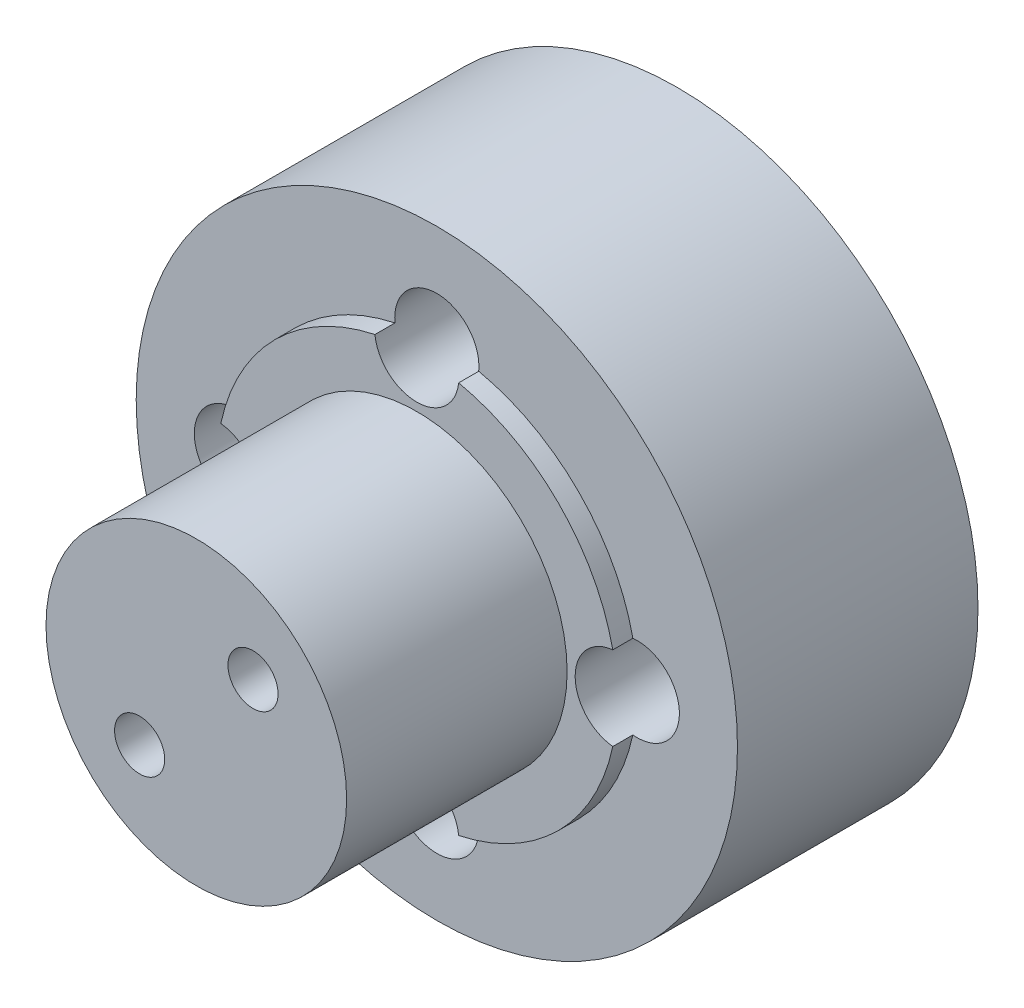
ISO-10303-21;
HEADER;
FILE_DESCRIPTION(('STEP AP214'),'2;1');
FILE_NAME('part.step','',(''),(''),'','','');
FILE_SCHEMA(('AUTOMOTIVE_DESIGN { 1 0 10303 214 1 1 1 1 }'));
ENDSEC;
DATA;
#1=APPLICATION_CONTEXT('core data for automotive mechanical design processes');
#2=APPLICATION_PROTOCOL_DEFINITION('international standard','automotive_design',2000,#1);
#3=PRODUCT_CONTEXT('',#1,'mechanical');
#4=PRODUCT('Part','Part','',(#3));
#5=PRODUCT_RELATED_PRODUCT_CATEGORY('part','',(#4));
#6=PRODUCT_DEFINITION_FORMATION('','',#4);
#7=PRODUCT_DEFINITION_CONTEXT('part definition',#1,'design');
#8=PRODUCT_DEFINITION('design','',#6,#7);
#9=PRODUCT_DEFINITION_SHAPE('','',#8);
#10=(LENGTH_UNIT() NAMED_UNIT(*) SI_UNIT(.MILLI.,.METRE.));
#11=(NAMED_UNIT(*) PLANE_ANGLE_UNIT() SI_UNIT($,.RADIAN.));
#12=(NAMED_UNIT(*) SI_UNIT($,.STERADIAN.) SOLID_ANGLE_UNIT());
#13=UNCERTAINTY_MEASURE_WITH_UNIT(LENGTH_MEASURE(1.E-05),#10,'distance_accuracy_value','');
#14=(GEOMETRIC_REPRESENTATION_CONTEXT(3) GLOBAL_UNCERTAINTY_ASSIGNED_CONTEXT((#13)) GLOBAL_UNIT_ASSIGNED_CONTEXT((#10,
#11,#12)) REPRESENTATION_CONTEXT('',''));
#15=CARTESIAN_POINT('',(0.,0.,0.));
#16=DIRECTION('',(0.,0.,1.));
#17=DIRECTION('',(1.,0.,0.));
#18=AXIS2_PLACEMENT_3D('',#15,#16,#17);
#19=CARTESIAN_POINT('',(0.,0.,13.));
#20=DIRECTION('',(0.,0.,-1.));
#21=DIRECTION('',(-1.,0.,0.));
#22=AXIS2_PLACEMENT_3D('',#19,#20,#21);
#23=CYLINDRICAL_SURFACE('',#22,10.);
#24=CARTESIAN_POINT('',(0.,0.,12.));
#25=DIRECTION('',(0.,0.,1.));
#26=DIRECTION('',(1.,0.,0.));
#27=AXIS2_PLACEMENT_3D('',#24,#25,#26);
#28=CIRCLE('',#27,10.);
#29=CARTESIAN_POINT('',(9.7795,2.08839166585197,12.));
#30=VERTEX_POINT('',#29);
#31=CARTESIAN_POINT('',(2.08839166585197,9.7795,12.));
#32=VERTEX_POINT('',#31);
#33=EDGE_CURVE('E121',#30,#32,#28,.T.);
#34=ORIENTED_EDGE('',*,*,#33,.T.);
#35=DIRECTION('',(0.,0.,-1.));
#36=VECTOR('',#35,1.);
#37=CARTESIAN_POINT('',(2.08839166585197,9.7795,12.));
#38=LINE('',#37,#36);
#39=CARTESIAN_POINT('',(2.08839166585197,9.7795,13.));
#40=VERTEX_POINT('',#39);
#41=EDGE_CURVE('E52',#32,#40,#38,.F.);
#42=ORIENTED_EDGE('',*,*,#41,.T.);
#43=CARTESIAN_POINT('',(0.,0.,13.));
#44=DIRECTION('',(0.,0.,1.));
#45=DIRECTION('',(1.,0.,0.));
#46=AXIS2_PLACEMENT_3D('',#43,#44,#45);
#47=CIRCLE('',#46,10.);
#48=CARTESIAN_POINT('',(9.7795,2.08839166585197,13.));
#49=VERTEX_POINT('',#48);
#50=EDGE_CURVE('E134',#49,#40,#47,.T.);
#51=ORIENTED_EDGE('',*,*,#50,.F.);
#52=DIRECTION('',(0.,0.,-1.));
#53=VECTOR('',#52,1.);
#54=CARTESIAN_POINT('',(9.7795,2.08839166585197,12.));
#55=LINE('',#54,#53);
#56=EDGE_CURVE('E160',#49,#30,#55,.T.);
#57=ORIENTED_EDGE('',*,*,#56,.T.);
#58=EDGE_LOOP('',(#34,#42,#51,#57));
#59=FACE_BOUND('',#58,.T.);
#60=ADVANCED_FACE('F37',(#59),#23,.T.);
#61=CARTESIAN_POINT('',(-2.08839166585197,9.7795,13.));
#62=VERTEX_POINT('',#61);
#63=CARTESIAN_POINT('',(-9.7795,2.08839166585197,13.));
#64=VERTEX_POINT('',#63);
#65=EDGE_CURVE('E116',#62,#64,#47,.T.);
#66=ORIENTED_EDGE('',*,*,#65,.F.);
#67=DIRECTION('',(0.,0.,-1.));
#68=VECTOR('',#67,1.);
#69=CARTESIAN_POINT('',(-2.08839166585197,9.7795,12.));
#70=LINE('',#69,#68);
#71=CARTESIAN_POINT('',(-2.08839166585197,9.7795,12.));
#72=VERTEX_POINT('',#71);
#73=EDGE_CURVE('E104',#62,#72,#70,.T.);
#74=ORIENTED_EDGE('',*,*,#73,.T.);
#75=CARTESIAN_POINT('',(-9.7795,2.08839166585197,12.));
#76=VERTEX_POINT('',#75);
#77=EDGE_CURVE('E115',#72,#76,#28,.T.);
#78=ORIENTED_EDGE('',*,*,#77,.T.);
#79=DIRECTION('',(0.,0.,-1.));
#80=VECTOR('',#79,1.);
#81=CARTESIAN_POINT('',(-9.7795,2.08839166585197,12.));
#82=LINE('',#81,#80);
#83=EDGE_CURVE('E11',#76,#64,#82,.F.);
#84=ORIENTED_EDGE('',*,*,#83,.T.);
#85=EDGE_LOOP('',(#66,#74,#78,#84));
#86=FACE_BOUND('',#85,.T.);
#87=ADVANCED_FACE('F114',(#86),#23,.T.);
#88=CARTESIAN_POINT('',(2.08839166585197,-9.7795,12.));
#89=VERTEX_POINT('',#88);
#90=CARTESIAN_POINT('',(9.7795,-2.08839166585197,12.));
#91=VERTEX_POINT('',#90);
#92=EDGE_CURVE('E124',#89,#91,#28,.T.);
#93=ORIENTED_EDGE('',*,*,#92,.T.);
#94=DIRECTION('',(0.,0.,-1.));
#95=VECTOR('',#94,1.);
#96=CARTESIAN_POINT('',(9.7795,-2.08839166585197,12.));
#97=LINE('',#96,#95);
#98=CARTESIAN_POINT('',(9.7795,-2.08839166585197,13.));
#99=VERTEX_POINT('',#98);
#100=EDGE_CURVE('E163',#91,#99,#97,.F.);
#101=ORIENTED_EDGE('',*,*,#100,.T.);
#102=CARTESIAN_POINT('',(2.08839166585197,-9.7795,13.));
#103=VERTEX_POINT('',#102);
#104=EDGE_CURVE('E140',#103,#99,#47,.T.);
#105=ORIENTED_EDGE('',*,*,#104,.F.);
#106=DIRECTION('',(0.,0.,-1.));
#107=VECTOR('',#106,1.);
#108=CARTESIAN_POINT('',(2.08839166585197,-9.7795,12.));
#109=LINE('',#108,#107);
#110=EDGE_CURVE('E154',#103,#89,#109,.T.);
#111=ORIENTED_EDGE('',*,*,#110,.T.);
#112=EDGE_LOOP('',(#93,#101,#105,#111));
#113=FACE_BOUND('',#112,.T.);
#114=ADVANCED_FACE('F190',(#113),#23,.T.);
#115=CARTESIAN_POINT('',(0.,0.,13.));
#116=DIRECTION('',(0.,0.,1.));
#117=DIRECTION('',(1.,0.,0.));
#118=AXIS2_PLACEMENT_3D('',#115,#116,#117);
#119=PLANE('',#118);
#120=CARTESIAN_POINT('',(0.,10.,13.));
#121=DIRECTION('',(0.,0.,1.));
#122=DIRECTION('',(1.,0.,0.));
#123=AXIS2_PLACEMENT_3D('',#120,#121,#122);
#124=CIRCLE('',#123,2.09999999999999);
#125=EDGE_CURVE('E282',#62,#40,#124,.T.);
#126=ORIENTED_EDGE('',*,*,#125,.F.);
#127=ORIENTED_EDGE('',*,*,#65,.T.);
#128=CARTESIAN_POINT('',(-10.,0.,13.));
#129=DIRECTION('',(0.,0.,1.));
#130=DIRECTION('',(1.,0.,0.));
#131=AXIS2_PLACEMENT_3D('',#128,#129,#130);
#132=CIRCLE('',#131,2.09999999999999);
#133=CARTESIAN_POINT('',(-9.7795,-2.08839166585197,13.));
#134=VERTEX_POINT('',#133);
#135=EDGE_CURVE('E286',#134,#64,#132,.T.);
#136=ORIENTED_EDGE('',*,*,#135,.F.);
#137=CARTESIAN_POINT('',(-2.08839166585197,-9.7795,13.));
#138=VERTEX_POINT('',#137);
#139=EDGE_CURVE('E129',#134,#138,#47,.T.);
#140=ORIENTED_EDGE('',*,*,#139,.T.);
#141=CARTESIAN_POINT('',(0.,-10.,13.));
#142=DIRECTION('',(0.,0.,1.));
#143=DIRECTION('',(1.,0.,0.));
#144=AXIS2_PLACEMENT_3D('',#141,#142,#143);
#145=CIRCLE('',#144,2.09999999999999);
#146=EDGE_CURVE('E172',#103,#138,#145,.T.);
#147=ORIENTED_EDGE('',*,*,#146,.F.);
#148=ORIENTED_EDGE('',*,*,#104,.T.);
#149=CARTESIAN_POINT('',(10.,0.,13.));
#150=DIRECTION('',(0.,0.,1.));
#151=DIRECTION('',(1.,0.,0.));
#152=AXIS2_PLACEMENT_3D('',#149,#150,#151);
#153=CIRCLE('',#152,2.09999999999999);
#154=EDGE_CURVE('E289',#49,#99,#153,.T.);
#155=ORIENTED_EDGE('',*,*,#154,.F.);
#156=ORIENTED_EDGE('',*,*,#50,.T.);
#157=EDGE_LOOP('',(#126,#127,#136,#140,#147,#148,#155,#156));
#158=FACE_BOUND('',#157,.T.);
#159=CARTESIAN_POINT('',(0.,0.,13.));
#160=DIRECTION('',(0.,0.,1.));
#161=DIRECTION('',(1.,0.,0.));
#162=AXIS2_PLACEMENT_3D('',#159,#160,#161);
#163=CIRCLE('',#162,7.5);
#164=CARTESIAN_POINT('',(7.5,0.,13.));
#165=VERTEX_POINT('',#164);
#166=EDGE_CURVE('E175',#165,#165,#163,.T.);
#167=ORIENTED_EDGE('',*,*,#166,.F.);
#168=EDGE_LOOP('',(#167));
#169=FACE_BOUND('',#168,.T.);
#170=ADVANCED_FACE('F188',(#158,#169),#119,.T.);
#171=CARTESIAN_POINT('',(0.,0.,12.));
#172=DIRECTION('',(0.,0.,1.));
#173=DIRECTION('',(1.,0.,0.));
#174=AXIS2_PLACEMENT_3D('',#171,#172,#173);
#175=PLANE('',#174);
#176=CARTESIAN_POINT('',(0.,10.,12.));
#177=DIRECTION('',(0.,0.,1.));
#178=DIRECTION('',(1.,0.,0.));
#179=AXIS2_PLACEMENT_3D('',#176,#177,#178);
#180=CIRCLE('',#179,2.09999999999999);
#181=EDGE_CURVE('E100',#32,#72,#180,.T.);
#182=ORIENTED_EDGE('',*,*,#181,.F.);
#183=ORIENTED_EDGE('',*,*,#33,.F.);
#184=CARTESIAN_POINT('',(10.,0.,12.));
#185=DIRECTION('',(0.,0.,1.));
#186=DIRECTION('',(1.,0.,0.));
#187=AXIS2_PLACEMENT_3D('',#184,#185,#186);
#188=CIRCLE('',#187,2.09999999999999);
#189=EDGE_CURVE('E178',#91,#30,#188,.T.);
#190=ORIENTED_EDGE('',*,*,#189,.F.);
#191=ORIENTED_EDGE('',*,*,#92,.F.);
#192=CARTESIAN_POINT('',(0.,-10.,12.));
#193=DIRECTION('',(0.,0.,1.));
#194=DIRECTION('',(1.,0.,0.));
#195=AXIS2_PLACEMENT_3D('',#192,#193,#194);
#196=CIRCLE('',#195,2.09999999999999);
#197=CARTESIAN_POINT('',(-2.08839166585197,-9.7795,12.));
#198=VERTEX_POINT('',#197);
#199=EDGE_CURVE('E169',#198,#89,#196,.T.);
#200=ORIENTED_EDGE('',*,*,#199,.F.);
#201=CARTESIAN_POINT('',(-9.7795,-2.08839166585197,12.));
#202=VERTEX_POINT('',#201);
#203=EDGE_CURVE('E122',#202,#198,#28,.T.);
#204=ORIENTED_EDGE('',*,*,#203,.F.);
#205=CARTESIAN_POINT('',(-10.,0.,12.));
#206=DIRECTION('',(0.,0.,1.));
#207=DIRECTION('',(1.,0.,0.));
#208=AXIS2_PLACEMENT_3D('',#205,#206,#207);
#209=CIRCLE('',#208,2.09999999999999);
#210=EDGE_CURVE('E60',#76,#202,#209,.T.);
#211=ORIENTED_EDGE('',*,*,#210,.F.);
#212=ORIENTED_EDGE('',*,*,#77,.F.);
#213=EDGE_LOOP('',(#182,#183,#190,#191,#200,#204,#211,#212));
#214=FACE_BOUND('',#213,.T.);
#215=CARTESIAN_POINT('',(0.,0.,12.));
#216=DIRECTION('',(0.,0.,1.));
#217=DIRECTION('',(1.,0.,0.));
#218=AXIS2_PLACEMENT_3D('',#215,#216,#217);
#219=CIRCLE('',#218,15.);
#220=CARTESIAN_POINT('',(15.,0.,12.));
#221=VERTEX_POINT('',#220);
#222=EDGE_CURVE('E149',#221,#221,#219,.T.);
#223=ORIENTED_EDGE('',*,*,#222,.T.);
#224=EDGE_LOOP('',(#223));
#225=FACE_BOUND('',#224,.T.);
#226=ADVANCED_FACE('F118',(#214,#225),#175,.T.);
#227=CARTESIAN_POINT('',(0.,0.,12.));
#228=DIRECTION('',(0.,0.,-1.));
#229=DIRECTION('',(-1.,0.,0.));
#230=AXIS2_PLACEMENT_3D('',#227,#228,#229);
#231=CYLINDRICAL_SURFACE('',#230,15.);
#232=ORIENTED_EDGE('',*,*,#222,.F.);
#233=EDGE_LOOP('',(#232));
#234=FACE_BOUND('',#233,.T.);
#235=CARTESIAN_POINT('',(0.,0.,0.));
#236=DIRECTION('',(0.,0.,1.));
#237=DIRECTION('',(1.,0.,0.));
#238=AXIS2_PLACEMENT_3D('',#235,#236,#237);
#239=CIRCLE('',#238,15.);
#240=CARTESIAN_POINT('',(15.,0.,0.));
#241=VERTEX_POINT('',#240);
#242=EDGE_CURVE('E146',#241,#241,#239,.T.);
#243=ORIENTED_EDGE('',*,*,#242,.T.);
#244=EDGE_LOOP('',(#243));
#245=FACE_BOUND('',#244,.T.);
#246=ADVANCED_FACE('F39',(#234,#245),#231,.T.);
#247=CARTESIAN_POINT('',(0.,0.,0.));
#248=DIRECTION('',(0.,0.,1.));
#249=DIRECTION('',(1.,0.,0.));
#250=AXIS2_PLACEMENT_3D('',#247,#248,#249);
#251=PLANE('',#250);
#252=CARTESIAN_POINT('',(-2.82842712474618,-2.82842712474619,0.));
#253=DIRECTION('',(0.,0.,1.));
#254=DIRECTION('',(1.,0.,0.));
#255=AXIS2_PLACEMENT_3D('',#252,#253,#254);
#256=CIRCLE('',#255,1.25);
#257=CARTESIAN_POINT('',(-1.57842712474619,-2.82842712474619,0.));
#258=VERTEX_POINT('',#257);
#259=EDGE_CURVE('E222',#258,#258,#256,.T.);
#260=ORIENTED_EDGE('',*,*,#259,.T.);
#261=EDGE_LOOP('',(#260));
#262=FACE_BOUND('',#261,.T.);
#263=CARTESIAN_POINT('',(2.82842712474618,2.8284271247462,0.));
#264=DIRECTION('',(0.,0.,1.));
#265=DIRECTION('',(1.,0.,0.));
#266=AXIS2_PLACEMENT_3D('',#263,#264,#265);
#267=CIRCLE('',#266,1.25);
#268=CARTESIAN_POINT('',(4.07842712474618,2.8284271247462,0.));
#269=VERTEX_POINT('',#268);
#270=EDGE_CURVE('E226',#269,#269,#267,.T.);
#271=ORIENTED_EDGE('',*,*,#270,.T.);
#272=EDGE_LOOP('',(#271));
#273=FACE_BOUND('',#272,.T.);
#274=CARTESIAN_POINT('',(0.,10.,0.));
#275=DIRECTION('',(0.,0.,-1.));
#276=DIRECTION('',(-1.,0.,0.));
#277=AXIS2_PLACEMENT_3D('',#274,#275,#276);
#278=CIRCLE('',#277,2.09999999999999);
#279=CARTESIAN_POINT('',(-2.09999999999999,10.,0.));
#280=VERTEX_POINT('',#279);
#281=EDGE_CURVE('E110',#280,#280,#278,.T.);
#282=ORIENTED_EDGE('',*,*,#281,.F.);
#283=EDGE_LOOP('',(#282));
#284=FACE_BOUND('',#283,.T.);
#285=CARTESIAN_POINT('',(-10.,0.,0.));
#286=DIRECTION('',(0.,0.,-1.));
#287=DIRECTION('',(-1.,0.,0.));
#288=AXIS2_PLACEMENT_3D('',#285,#286,#287);
#289=CIRCLE('',#288,2.09999999999999);
#290=CARTESIAN_POINT('',(-12.1,0.,0.));
#291=VERTEX_POINT('',#290);
#292=EDGE_CURVE('E233',#291,#291,#289,.T.);
#293=ORIENTED_EDGE('',*,*,#292,.F.);
#294=EDGE_LOOP('',(#293));
#295=FACE_BOUND('',#294,.T.);
#296=CARTESIAN_POINT('',(10.,0.,0.));
#297=DIRECTION('',(0.,0.,-1.));
#298=DIRECTION('',(-1.,0.,0.));
#299=AXIS2_PLACEMENT_3D('',#296,#297,#298);
#300=CIRCLE('',#299,2.09999999999999);
#301=CARTESIAN_POINT('',(7.90000000000001,0.,0.));
#302=VERTEX_POINT('',#301);
#303=EDGE_CURVE('E237',#302,#302,#300,.T.);
#304=ORIENTED_EDGE('',*,*,#303,.F.);
#305=EDGE_LOOP('',(#304));
#306=FACE_BOUND('',#305,.T.);
#307=CARTESIAN_POINT('',(0.,-10.,0.));
#308=DIRECTION('',(0.,0.,-1.));
#309=DIRECTION('',(-1.,0.,0.));
#310=AXIS2_PLACEMENT_3D('',#307,#308,#309);
#311=CIRCLE('',#310,2.09999999999999);
#312=CARTESIAN_POINT('',(-2.09999999999999,-10.,0.));
#313=VERTEX_POINT('',#312);
#314=EDGE_CURVE('E173',#313,#313,#311,.T.);
#315=ORIENTED_EDGE('',*,*,#314,.F.);
#316=EDGE_LOOP('',(#315));
#317=FACE_BOUND('',#316,.T.);
#318=ORIENTED_EDGE('',*,*,#242,.F.);
#319=EDGE_LOOP('',(#318));
#320=FACE_BOUND('',#319,.T.);
#321=ADVANCED_FACE('F205',(#262,#273,#284,#295,#306,#317,#320),#251,.F.);
#322=ORIENTED_EDGE('',*,*,#139,.F.);
#323=DIRECTION('',(0.,0.,-1.));
#324=VECTOR('',#323,1.);
#325=CARTESIAN_POINT('',(-9.7795,-2.08839166585197,12.));
#326=LINE('',#325,#324);
#327=EDGE_CURVE('E45',#134,#202,#326,.T.);
#328=ORIENTED_EDGE('',*,*,#327,.T.);
#329=ORIENTED_EDGE('',*,*,#203,.T.);
#330=DIRECTION('',(0.,0.,-1.));
#331=VECTOR('',#330,1.);
#332=CARTESIAN_POINT('',(-2.08839166585197,-9.7795,12.));
#333=LINE('',#332,#331);
#334=EDGE_CURVE('E157',#198,#138,#333,.F.);
#335=ORIENTED_EDGE('',*,*,#334,.T.);
#336=EDGE_LOOP('',(#322,#328,#329,#335));
#337=FACE_BOUND('',#336,.T.);
#338=ADVANCED_FACE('F165',(#337),#23,.T.);
#339=CARTESIAN_POINT('',(0.,0.,24.));
#340=DIRECTION('',(0.,0.,-1.));
#341=DIRECTION('',(-1.,0.,0.));
#342=AXIS2_PLACEMENT_3D('',#339,#340,#341);
#343=CYLINDRICAL_SURFACE('',#342,7.5);
#344=CARTESIAN_POINT('',(0.,0.,24.));
#345=DIRECTION('',(0.,0.,1.));
#346=DIRECTION('',(1.,0.,0.));
#347=AXIS2_PLACEMENT_3D('',#344,#345,#346);
#348=CIRCLE('',#347,7.5);
#349=CARTESIAN_POINT('',(7.5,0.,24.));
#350=VERTEX_POINT('',#349);
#351=EDGE_CURVE('E125',#350,#350,#348,.T.);
#352=ORIENTED_EDGE('',*,*,#351,.F.);
#353=EDGE_LOOP('',(#352));
#354=FACE_BOUND('',#353,.T.);
#355=ORIENTED_EDGE('',*,*,#166,.T.);
#356=EDGE_LOOP('',(#355));
#357=FACE_BOUND('',#356,.T.);
#358=ADVANCED_FACE('F186',(#354,#357),#343,.T.);
#359=CARTESIAN_POINT('',(0.,0.,24.));
#360=DIRECTION('',(0.,0.,1.));
#361=DIRECTION('',(1.,0.,0.));
#362=AXIS2_PLACEMENT_3D('',#359,#360,#361);
#363=PLANE('',#362);
#364=CARTESIAN_POINT('',(-2.82842712474618,-2.82842712474619,24.));
#365=DIRECTION('',(0.,0.,1.));
#366=DIRECTION('',(1.,0.,0.));
#367=AXIS2_PLACEMENT_3D('',#364,#365,#366);
#368=CIRCLE('',#367,1.24999999999999);
#369=CARTESIAN_POINT('',(-1.5784271247462,-2.82842712474619,24.));
#370=VERTEX_POINT('',#369);
#371=EDGE_CURVE('E272',#370,#370,#368,.T.);
#372=ORIENTED_EDGE('',*,*,#371,.F.);
#373=EDGE_LOOP('',(#372));
#374=FACE_BOUND('',#373,.T.);
#375=CARTESIAN_POINT('',(2.82842712474618,2.8284271247462,24.));
#376=DIRECTION('',(0.,0.,1.));
#377=DIRECTION('',(1.,0.,0.));
#378=AXIS2_PLACEMENT_3D('',#375,#376,#377);
#379=CIRCLE('',#378,1.24999999999999);
#380=CARTESIAN_POINT('',(4.07842712474617,2.8284271247462,24.));
#381=VERTEX_POINT('',#380);
#382=EDGE_CURVE('E274',#381,#381,#379,.T.);
#383=ORIENTED_EDGE('',*,*,#382,.F.);
#384=EDGE_LOOP('',(#383));
#385=FACE_BOUND('',#384,.T.);
#386=ORIENTED_EDGE('',*,*,#351,.T.);
#387=EDGE_LOOP('',(#386));
#388=FACE_BOUND('',#387,.T.);
#389=ADVANCED_FACE('F210',(#374,#385,#388),#363,.T.);
#390=CARTESIAN_POINT('',(0.,-10.,0.));
#391=DIRECTION('',(0.,0.,-1.));
#392=DIRECTION('',(-1.,0.,0.));
#393=AXIS2_PLACEMENT_3D('',#390,#391,#392);
#394=CYLINDRICAL_SURFACE('',#393,2.09999999999999);
#395=ORIENTED_EDGE('',*,*,#314,.T.);
#396=EDGE_LOOP('',(#395));
#397=FACE_BOUND('',#396,.T.);
#398=ORIENTED_EDGE('',*,*,#199,.T.);
#399=ORIENTED_EDGE('',*,*,#110,.F.);
#400=ORIENTED_EDGE('',*,*,#146,.T.);
#401=ORIENTED_EDGE('',*,*,#334,.F.);
#402=EDGE_LOOP('',(#398,#399,#400,#401));
#403=FACE_BOUND('',#402,.T.);
#404=ADVANCED_FACE('F241',(#397,#403),#394,.F.);
#405=CARTESIAN_POINT('',(10.,0.,0.));
#406=DIRECTION('',(0.,0.,-1.));
#407=DIRECTION('',(-1.,0.,0.));
#408=AXIS2_PLACEMENT_3D('',#405,#406,#407);
#409=CYLINDRICAL_SURFACE('',#408,2.09999999999999);
#410=ORIENTED_EDGE('',*,*,#303,.T.);
#411=EDGE_LOOP('',(#410));
#412=FACE_BOUND('',#411,.T.);
#413=ORIENTED_EDGE('',*,*,#189,.T.);
#414=ORIENTED_EDGE('',*,*,#56,.F.);
#415=ORIENTED_EDGE('',*,*,#154,.T.);
#416=ORIENTED_EDGE('',*,*,#100,.F.);
#417=EDGE_LOOP('',(#413,#414,#415,#416));
#418=FACE_BOUND('',#417,.T.);
#419=ADVANCED_FACE('F243',(#412,#418),#409,.F.);
#420=CARTESIAN_POINT('',(-10.,0.,0.));
#421=DIRECTION('',(0.,0.,-1.));
#422=DIRECTION('',(-1.,0.,0.));
#423=AXIS2_PLACEMENT_3D('',#420,#421,#422);
#424=CYLINDRICAL_SURFACE('',#423,2.09999999999999);
#425=ORIENTED_EDGE('',*,*,#292,.T.);
#426=EDGE_LOOP('',(#425));
#427=FACE_BOUND('',#426,.T.);
#428=ORIENTED_EDGE('',*,*,#210,.T.);
#429=ORIENTED_EDGE('',*,*,#327,.F.);
#430=ORIENTED_EDGE('',*,*,#135,.T.);
#431=ORIENTED_EDGE('',*,*,#83,.F.);
#432=EDGE_LOOP('',(#428,#429,#430,#431));
#433=FACE_BOUND('',#432,.T.);
#434=ADVANCED_FACE('F249',(#427,#433),#424,.F.);
#435=CARTESIAN_POINT('',(0.,10.,0.));
#436=DIRECTION('',(0.,0.,-1.));
#437=DIRECTION('',(-1.,0.,0.));
#438=AXIS2_PLACEMENT_3D('',#435,#436,#437);
#439=CYLINDRICAL_SURFACE('',#438,2.09999999999999);
#440=ORIENTED_EDGE('',*,*,#125,.T.);
#441=ORIENTED_EDGE('',*,*,#41,.F.);
#442=ORIENTED_EDGE('',*,*,#181,.T.);
#443=ORIENTED_EDGE('',*,*,#73,.F.);
#444=EDGE_LOOP('',(#440,#441,#442,#443));
#445=FACE_BOUND('',#444,.T.);
#446=ORIENTED_EDGE('',*,*,#281,.T.);
#447=EDGE_LOOP('',(#446));
#448=FACE_BOUND('',#447,.T.);
#449=ADVANCED_FACE('F102',(#445,#448),#439,.F.);
#450=CARTESIAN_POINT('',(2.82842712474618,2.8284271247462,24.));
#451=DIRECTION('',(0.,0.,1.));
#452=DIRECTION('',(1.,0.,0.));
#453=AXIS2_PLACEMENT_3D('',#450,#451,#452);
#454=CYLINDRICAL_SURFACE('',#453,1.24999999999999);
#455=ORIENTED_EDGE('',*,*,#270,.F.);
#456=EDGE_LOOP('',(#455));
#457=FACE_BOUND('',#456,.T.);
#458=ORIENTED_EDGE('',*,*,#382,.T.);
#459=EDGE_LOOP('',(#458));
#460=FACE_BOUND('',#459,.T.);
#461=ADVANCED_FACE('F260',(#457,#460),#454,.F.);
#462=CARTESIAN_POINT('',(-2.82842712474618,-2.82842712474619,24.));
#463=DIRECTION('',(0.,0.,1.));
#464=DIRECTION('',(1.,0.,0.));
#465=AXIS2_PLACEMENT_3D('',#462,#463,#464);
#466=CYLINDRICAL_SURFACE('',#465,1.24999999999999);
#467=ORIENTED_EDGE('',*,*,#259,.F.);
#468=EDGE_LOOP('',(#467));
#469=FACE_BOUND('',#468,.T.);
#470=ORIENTED_EDGE('',*,*,#371,.T.);
#471=EDGE_LOOP('',(#470));
#472=FACE_BOUND('',#471,.T.);
#473=ADVANCED_FACE('F263',(#469,#472),#466,.F.);
#474=CLOSED_SHELL('',(#60,#87,#114,#170,#226,#246,#321,#338,#358,#389,#404,#419,#434,#449,#461,#473));
#475=MANIFOLD_SOLID_BREP('B2',#474);
#476=ADVANCED_BREP_SHAPE_REPRESENTATION('',(#18,#475),#14);
#477=SHAPE_DEFINITION_REPRESENTATION(#9,#476);
ENDSEC;
END-ISO-10303-21;
